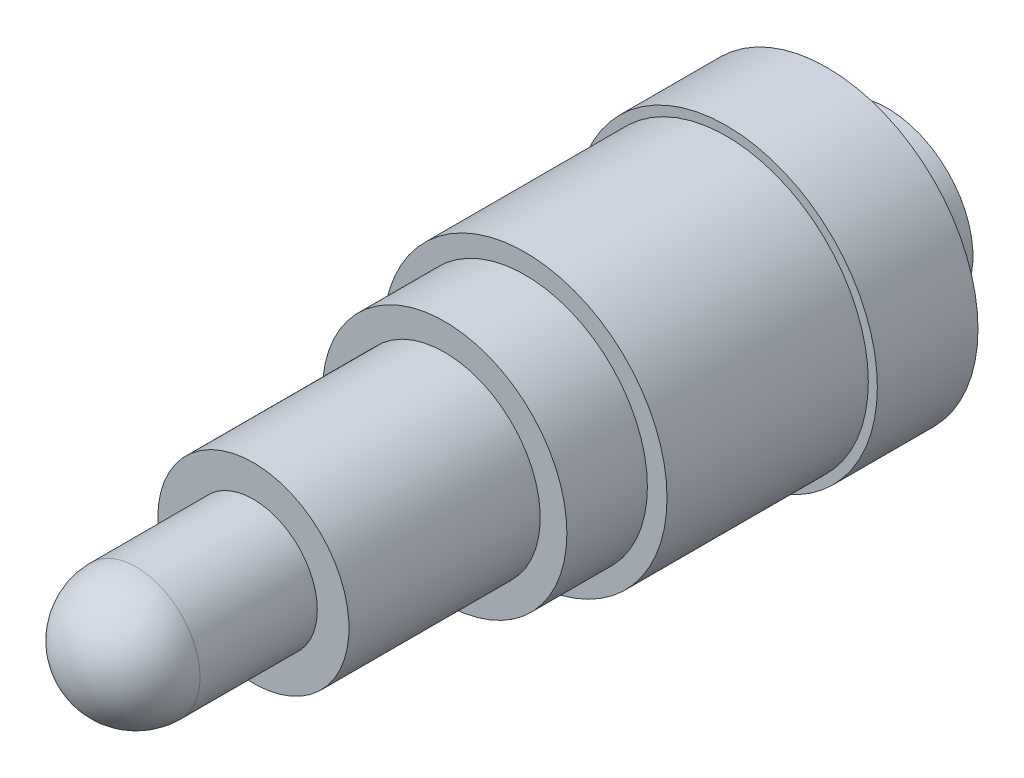
ISO-10303-21;
HEADER;
FILE_DESCRIPTION(('STEP AP214'),'2;1');
FILE_NAME('part.step','',(''),(''),'','','');
FILE_SCHEMA(('AUTOMOTIVE_DESIGN { 1 0 10303 214 1 1 1 1 }'));
ENDSEC;
DATA;
#1=APPLICATION_CONTEXT('core data for automotive mechanical design processes');
#2=APPLICATION_PROTOCOL_DEFINITION('international standard','automotive_design',2000,#1);
#3=PRODUCT_CONTEXT('',#1,'mechanical');
#4=PRODUCT('Part','Part','',(#3));
#5=PRODUCT_RELATED_PRODUCT_CATEGORY('part','',(#4));
#6=PRODUCT_DEFINITION_FORMATION('','',#4);
#7=PRODUCT_DEFINITION_CONTEXT('part definition',#1,'design');
#8=PRODUCT_DEFINITION('design','',#6,#7);
#9=PRODUCT_DEFINITION_SHAPE('','',#8);
#10=(LENGTH_UNIT() NAMED_UNIT(*) SI_UNIT(.MILLI.,.METRE.));
#11=(NAMED_UNIT(*) PLANE_ANGLE_UNIT() SI_UNIT($,.RADIAN.));
#12=(NAMED_UNIT(*) SI_UNIT($,.STERADIAN.) SOLID_ANGLE_UNIT());
#13=UNCERTAINTY_MEASURE_WITH_UNIT(LENGTH_MEASURE(1.E-05),#10,'distance_accuracy_value','');
#14=(GEOMETRIC_REPRESENTATION_CONTEXT(3) GLOBAL_UNCERTAINTY_ASSIGNED_CONTEXT((#13)) GLOBAL_UNIT_ASSIGNED_CONTEXT((#10,
#11,#12)) REPRESENTATION_CONTEXT('',''));
#15=CARTESIAN_POINT('',(0.,0.,0.));
#16=DIRECTION('',(0.,0.,1.));
#17=DIRECTION('',(1.,0.,0.));
#18=AXIS2_PLACEMENT_3D('',#15,#16,#17);
#19=CARTESIAN_POINT('',(0.,0.,9.));
#20=DIRECTION('',(0.,0.,-1.));
#21=DIRECTION('',(-1.,0.,0.));
#22=AXIS2_PLACEMENT_3D('',#19,#20,#21);
#23=CYLINDRICAL_SURFACE('',#22,3.175);
#24=CARTESIAN_POINT('',(0.,0.,5.825));
#25=DIRECTION('',(0.,0.,-1.));
#26=DIRECTION('',(-1.,0.,0.));
#27=AXIS2_PLACEMENT_3D('',#24,#25,#26);
#28=CIRCLE('',#27,3.175);
#29=CARTESIAN_POINT('',(-3.175,0.,5.825));
#30=VERTEX_POINT('',#29);
#31=EDGE_CURVE('E10',#30,#30,#28,.T.);
#32=ORIENTED_EDGE('',*,*,#31,.T.);
#33=EDGE_LOOP('',(#32));
#34=FACE_BOUND('',#33,.T.);
#35=CARTESIAN_POINT('',(0.,0.,0.));
#36=DIRECTION('',(0.,0.,1.));
#37=DIRECTION('',(1.,0.,0.));
#38=AXIS2_PLACEMENT_3D('',#35,#36,#37);
#39=CIRCLE('',#38,3.175);
#40=CARTESIAN_POINT('',(3.175,0.,0.));
#41=VERTEX_POINT('',#40);
#42=EDGE_CURVE('E48',#41,#41,#39,.T.);
#43=ORIENTED_EDGE('',*,*,#42,.T.);
#44=EDGE_LOOP('',(#43));
#45=FACE_BOUND('',#44,.T.);
#46=ADVANCED_FACE('F37',(#34,#45),#23,.T.);
#47=CARTESIAN_POINT('',(0.,0.,-9.5));
#48=DIRECTION('',(0.,0.,1.));
#49=DIRECTION('',(1.,0.,0.));
#50=AXIS2_PLACEMENT_3D('',#47,#48,#49);
#51=CYLINDRICAL_SURFACE('',#50,4.75);
#52=CARTESIAN_POINT('',(0.,0.,-9.5));
#53=DIRECTION('',(0.,0.,-1.));
#54=DIRECTION('',(-1.,0.,0.));
#55=AXIS2_PLACEMENT_3D('',#52,#53,#54);
#56=CIRCLE('',#55,4.75);
#57=CARTESIAN_POINT('',(-4.75,0.,-9.5));
#58=VERTEX_POINT('',#57);
#59=EDGE_CURVE('E53',#58,#58,#56,.T.);
#60=ORIENTED_EDGE('',*,*,#59,.F.);
#61=EDGE_LOOP('',(#60));
#62=FACE_BOUND('',#61,.T.);
#63=CARTESIAN_POINT('',(0.,0.,0.));
#64=DIRECTION('',(0.,0.,-1.));
#65=DIRECTION('',(-1.,0.,0.));
#66=AXIS2_PLACEMENT_3D('',#63,#64,#65);
#67=CIRCLE('',#66,4.75);
#68=CARTESIAN_POINT('',(-4.75,0.,0.));
#69=VERTEX_POINT('',#68);
#70=EDGE_CURVE('E73',#69,#69,#67,.T.);
#71=ORIENTED_EDGE('',*,*,#70,.T.);
#72=EDGE_LOOP('',(#71));
#73=FACE_BOUND('',#72,.T.);
#74=ADVANCED_FACE('F81',(#62,#73),#51,.T.);
#75=CARTESIAN_POINT('',(0.,0.,0.));
#76=DIRECTION('',(0.,0.,-1.));
#77=DIRECTION('',(-1.,0.,0.));
#78=AXIS2_PLACEMENT_3D('',#75,#76,#77);
#79=PLANE('',#78);
#80=ORIENTED_EDGE('',*,*,#42,.F.);
#81=EDGE_LOOP('',(#80));
#82=FACE_BOUND('',#81,.T.);
#83=ORIENTED_EDGE('',*,*,#70,.F.);
#84=EDGE_LOOP('',(#83));
#85=FACE_BOUND('',#84,.T.);
#86=ADVANCED_FACE('F83',(#82,#85),#79,.F.);
#87=CARTESIAN_POINT('',(0.,0.,-13.5));
#88=DIRECTION('',(0.,0.,1.));
#89=DIRECTION('',(1.,0.,0.));
#90=AXIS2_PLACEMENT_3D('',#87,#88,#89);
#91=CYLINDRICAL_SURFACE('',#90,6.075);
#92=CARTESIAN_POINT('',(0.,0.,-13.5));
#93=DIRECTION('',(0.,0.,-1.));
#94=DIRECTION('',(-1.,0.,0.));
#95=AXIS2_PLACEMENT_3D('',#92,#93,#94);
#96=CIRCLE('',#95,6.075);
#97=CARTESIAN_POINT('',(-6.075,0.,-13.5));
#98=VERTEX_POINT('',#97);
#99=EDGE_CURVE('E70',#98,#98,#96,.T.);
#100=ORIENTED_EDGE('',*,*,#99,.F.);
#101=EDGE_LOOP('',(#100));
#102=FACE_BOUND('',#101,.T.);
#103=CARTESIAN_POINT('',(0.,0.,-9.5));
#104=DIRECTION('',(0.,0.,-1.));
#105=DIRECTION('',(-1.,0.,0.));
#106=AXIS2_PLACEMENT_3D('',#103,#104,#105);
#107=CIRCLE('',#106,6.075);
#108=CARTESIAN_POINT('',(-6.075,0.,-9.5));
#109=VERTEX_POINT('',#108);
#110=EDGE_CURVE('E67',#109,#109,#107,.T.);
#111=ORIENTED_EDGE('',*,*,#110,.T.);
#112=EDGE_LOOP('',(#111));
#113=FACE_BOUND('',#112,.T.);
#114=ADVANCED_FACE('F85',(#102,#113),#91,.T.);
#115=CARTESIAN_POINT('',(0.,0.,-9.5));
#116=DIRECTION('',(0.,0.,-1.));
#117=DIRECTION('',(-1.,0.,0.));
#118=AXIS2_PLACEMENT_3D('',#115,#116,#117);
#119=PLANE('',#118);
#120=ORIENTED_EDGE('',*,*,#59,.T.);
#121=EDGE_LOOP('',(#120));
#122=FACE_BOUND('',#121,.T.);
#123=ORIENTED_EDGE('',*,*,#110,.F.);
#124=EDGE_LOOP('',(#123));
#125=FACE_BOUND('',#124,.T.);
#126=ADVANCED_FACE('F92',(#122,#125),#119,.F.);
#127=CARTESIAN_POINT('',(0.,0.,-23.5));
#128=DIRECTION('',(0.,0.,1.));
#129=DIRECTION('',(1.,0.,0.));
#130=AXIS2_PLACEMENT_3D('',#127,#128,#129);
#131=CYLINDRICAL_SURFACE('',#130,7.05);
#132=CARTESIAN_POINT('',(0.,0.,-23.5));
#133=DIRECTION('',(0.,0.,-1.));
#134=DIRECTION('',(-1.,0.,0.));
#135=AXIS2_PLACEMENT_3D('',#132,#133,#134);
#136=CIRCLE('',#135,7.05);
#137=CARTESIAN_POINT('',(-7.05,0.,-23.5));
#138=VERTEX_POINT('',#137);
#139=EDGE_CURVE('E64',#138,#138,#136,.T.);
#140=ORIENTED_EDGE('',*,*,#139,.F.);
#141=EDGE_LOOP('',(#140));
#142=FACE_BOUND('',#141,.T.);
#143=CARTESIAN_POINT('',(0.,0.,-13.5));
#144=DIRECTION('',(0.,0.,-1.));
#145=DIRECTION('',(-1.,0.,0.));
#146=AXIS2_PLACEMENT_3D('',#143,#144,#145);
#147=CIRCLE('',#146,7.05);
#148=CARTESIAN_POINT('',(-7.05,0.,-13.5));
#149=VERTEX_POINT('',#148);
#150=EDGE_CURVE('E60',#149,#149,#147,.T.);
#151=ORIENTED_EDGE('',*,*,#150,.T.);
#152=EDGE_LOOP('',(#151));
#153=FACE_BOUND('',#152,.T.);
#154=ADVANCED_FACE('F130',(#142,#153),#131,.T.);
#155=CARTESIAN_POINT('',(0.,0.,-13.5));
#156=DIRECTION('',(0.,0.,-1.));
#157=DIRECTION('',(-1.,0.,0.));
#158=AXIS2_PLACEMENT_3D('',#155,#156,#157);
#159=PLANE('',#158);
#160=ORIENTED_EDGE('',*,*,#99,.T.);
#161=EDGE_LOOP('',(#160));
#162=FACE_BOUND('',#161,.T.);
#163=ORIENTED_EDGE('',*,*,#150,.F.);
#164=EDGE_LOOP('',(#163));
#165=FACE_BOUND('',#164,.T.);
#166=ADVANCED_FACE('F141',(#162,#165),#159,.F.);
#167=CARTESIAN_POINT('',(0.,0.,-28.5));
#168=DIRECTION('',(0.,0.,1.));
#169=DIRECTION('',(1.,0.,0.));
#170=AXIS2_PLACEMENT_3D('',#167,#168,#169);
#171=CYLINDRICAL_SURFACE('',#170,7.5);
#172=CARTESIAN_POINT('',(0.,0.,-28.5));
#173=DIRECTION('',(0.,0.,-1.));
#174=DIRECTION('',(-1.,0.,0.));
#175=AXIS2_PLACEMENT_3D('',#172,#173,#174);
#176=CIRCLE('',#175,7.5);
#177=CARTESIAN_POINT('',(-7.5,0.,-28.5));
#178=VERTEX_POINT('',#177);
#179=EDGE_CURVE('E57',#178,#178,#176,.T.);
#180=ORIENTED_EDGE('',*,*,#179,.F.);
#181=EDGE_LOOP('',(#180));
#182=FACE_BOUND('',#181,.T.);
#183=CARTESIAN_POINT('',(0.,0.,-23.5));
#184=DIRECTION('',(0.,0.,-1.));
#185=DIRECTION('',(-1.,0.,0.));
#186=AXIS2_PLACEMENT_3D('',#183,#184,#185);
#187=CIRCLE('',#186,7.5);
#188=CARTESIAN_POINT('',(-7.5,0.,-23.5));
#189=VERTEX_POINT('',#188);
#190=EDGE_CURVE('E61',#189,#189,#187,.T.);
#191=ORIENTED_EDGE('',*,*,#190,.T.);
#192=EDGE_LOOP('',(#191));
#193=FACE_BOUND('',#192,.T.);
#194=ADVANCED_FACE('F152',(#182,#193),#171,.T.);
#195=CARTESIAN_POINT('',(0.,0.,-28.5));
#196=DIRECTION('',(0.,0.,-1.));
#197=DIRECTION('',(-1.,0.,0.));
#198=AXIS2_PLACEMENT_3D('',#195,#196,#197);
#199=PLANE('',#198);
#200=CARTESIAN_POINT('',(0.,0.,-28.5));
#201=DIRECTION('',(0.,0.,-1.));
#202=DIRECTION('',(-1.,0.,0.));
#203=AXIS2_PLACEMENT_3D('',#200,#201,#202);
#204=CIRCLE('',#203,4.25);
#205=CARTESIAN_POINT('',(-4.25,0.,-28.5));
#206=VERTEX_POINT('',#205);
#207=EDGE_CURVE('E44',#206,#206,#204,.T.);
#208=ORIENTED_EDGE('',*,*,#207,.F.);
#209=EDGE_LOOP('',(#208));
#210=FACE_BOUND('',#209,.T.);
#211=ORIENTED_EDGE('',*,*,#179,.T.);
#212=EDGE_LOOP('',(#211));
#213=FACE_BOUND('',#212,.T.);
#214=ADVANCED_FACE('F163',(#210,#213),#199,.T.);
#215=CARTESIAN_POINT('',(0.,0.,-23.5));
#216=DIRECTION('',(0.,0.,-1.));
#217=DIRECTION('',(-1.,0.,0.));
#218=AXIS2_PLACEMENT_3D('',#215,#216,#217);
#219=PLANE('',#218);
#220=ORIENTED_EDGE('',*,*,#139,.T.);
#221=EDGE_LOOP('',(#220));
#222=FACE_BOUND('',#221,.T.);
#223=ORIENTED_EDGE('',*,*,#190,.F.);
#224=EDGE_LOOP('',(#223));
#225=FACE_BOUND('',#224,.T.);
#226=ADVANCED_FACE('F172',(#222,#225),#219,.F.);
#227=CARTESIAN_POINT('',(0.,0.,-31.5));
#228=DIRECTION('',(0.,0.,1.));
#229=DIRECTION('',(1.,0.,0.));
#230=AXIS2_PLACEMENT_3D('',#227,#228,#229);
#231=CYLINDRICAL_SURFACE('',#230,4.25);
#232=CARTESIAN_POINT('',(0.,0.,-31.5));
#233=DIRECTION('',(0.,0.,-1.));
#234=DIRECTION('',(-1.,0.,0.));
#235=AXIS2_PLACEMENT_3D('',#232,#233,#234);
#236=CIRCLE('',#235,4.25);
#237=CARTESIAN_POINT('',(-4.25,0.,-31.5));
#238=VERTEX_POINT('',#237);
#239=EDGE_CURVE('E56',#238,#238,#236,.T.);
#240=ORIENTED_EDGE('',*,*,#239,.F.);
#241=EDGE_LOOP('',(#240));
#242=FACE_BOUND('',#241,.T.);
#243=ORIENTED_EDGE('',*,*,#207,.T.);
#244=EDGE_LOOP('',(#243));
#245=FACE_BOUND('',#244,.T.);
#246=ADVANCED_FACE('F177',(#242,#245),#231,.T.);
#247=CARTESIAN_POINT('',(0.,0.,-31.5));
#248=DIRECTION('',(0.,0.,-1.));
#249=DIRECTION('',(-1.,0.,0.));
#250=AXIS2_PLACEMENT_3D('',#247,#248,#249);
#251=PLANE('',#250);
#252=ORIENTED_EDGE('',*,*,#239,.T.);
#253=EDGE_LOOP('',(#252));
#254=FACE_BOUND('',#253,.T.);
#255=ADVANCED_FACE('F195',(#254),#251,.T.);
#256=CARTESIAN_POINT('',(0.,0.,5.825));
#257=DIRECTION('',(0.,0.,1.));
#258=DIRECTION('',(1.,0.,0.));
#259=AXIS2_PLACEMENT_3D('',#256,#257,#258);
#260=SPHERICAL_SURFACE('',#259,3.175);
#261=ORIENTED_EDGE('',*,*,#31,.F.);
#262=EDGE_LOOP('',(#261));
#263=FACE_BOUND('',#262,.T.);
#264=ADVANCED_FACE('F39',(#263),#260,.T.);
#265=CLOSED_SHELL('',(#46,#74,#86,#114,#126,#154,#166,#194,#214,#226,#246,#255,#264));
#266=MANIFOLD_SOLID_BREP('B2',#265);
#267=ADVANCED_BREP_SHAPE_REPRESENTATION('',(#18,#266),#14);
#268=SHAPE_DEFINITION_REPRESENTATION(#9,#267);
ENDSEC;
END-ISO-10303-21;
